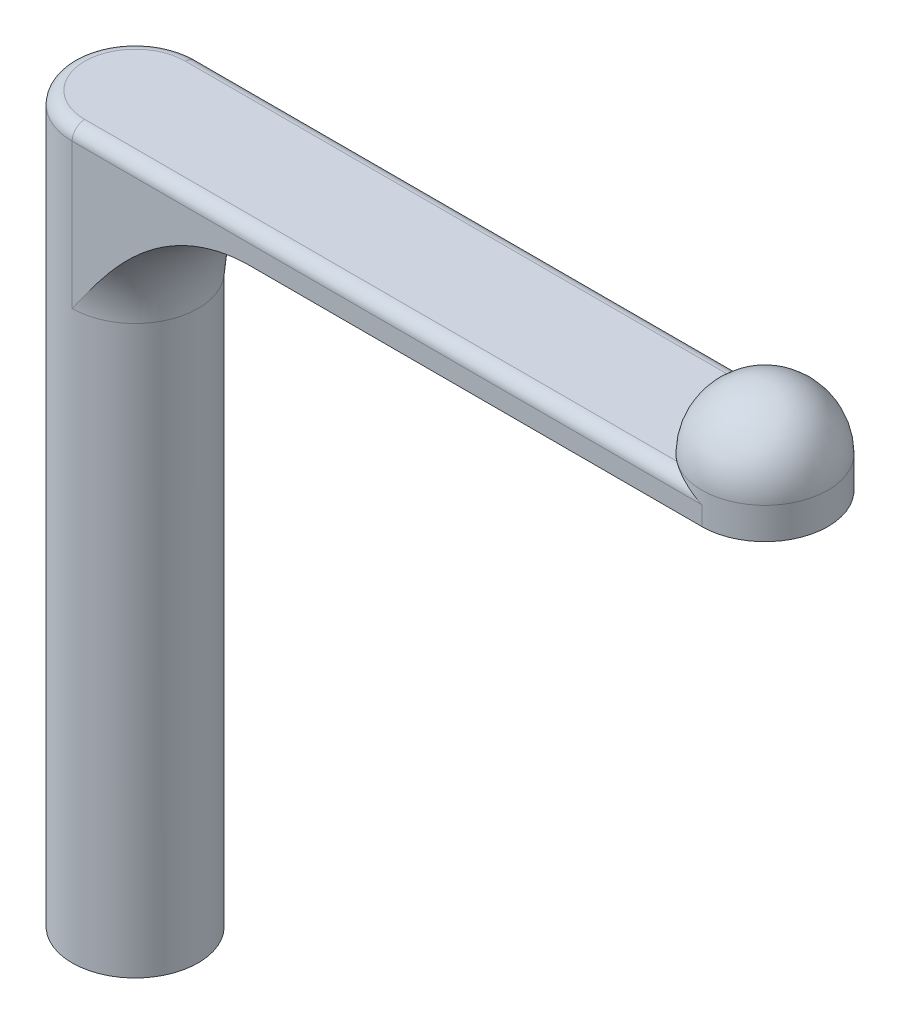
ISO-10303-21;
HEADER;
FILE_DESCRIPTION(('STEP AP214'),'2;1');
FILE_NAME('part.step','',(''),(''),'','','');
FILE_SCHEMA(('AUTOMOTIVE_DESIGN { 1 0 10303 214 1 1 1 1 }'));
ENDSEC;
DATA;
#1=APPLICATION_CONTEXT('core data for automotive mechanical design processes');
#2=APPLICATION_PROTOCOL_DEFINITION('international standard','automotive_design',2000,#1);
#3=PRODUCT_CONTEXT('',#1,'mechanical');
#4=PRODUCT('Part','Part','',(#3));
#5=PRODUCT_RELATED_PRODUCT_CATEGORY('part','',(#4));
#6=PRODUCT_DEFINITION_FORMATION('','',#4);
#7=PRODUCT_DEFINITION_CONTEXT('part definition',#1,'design');
#8=PRODUCT_DEFINITION('design','',#6,#7);
#9=PRODUCT_DEFINITION_SHAPE('','',#8);
#10=(LENGTH_UNIT() NAMED_UNIT(*) SI_UNIT(.MILLI.,.METRE.));
#11=(NAMED_UNIT(*) PLANE_ANGLE_UNIT() SI_UNIT($,.RADIAN.));
#12=(NAMED_UNIT(*) SI_UNIT($,.STERADIAN.) SOLID_ANGLE_UNIT());
#13=UNCERTAINTY_MEASURE_WITH_UNIT(LENGTH_MEASURE(1.E-05),#10,'distance_accuracy_value','');
#14=(GEOMETRIC_REPRESENTATION_CONTEXT(3) GLOBAL_UNCERTAINTY_ASSIGNED_CONTEXT((#13)) GLOBAL_UNIT_ASSIGNED_CONTEXT((#10,
#11,#12)) REPRESENTATION_CONTEXT('',''));
#15=CARTESIAN_POINT('',(0.,0.,0.));
#16=DIRECTION('',(0.,0.,1.));
#17=DIRECTION('',(1.,0.,0.));
#18=AXIS2_PLACEMENT_3D('',#15,#16,#17);
#19=CARTESIAN_POINT('',(0.,110.,0.));
#20=DIRECTION('',(0.,-1.,0.));
#21=DIRECTION('',(0.,0.,-1.));
#22=AXIS2_PLACEMENT_3D('',#19,#20,#21);
#23=CYLINDRICAL_SURFACE('',#22,10.);
#24=DIRECTION('',(0.,-1.,0.));
#25=VECTOR('',#24,1.);
#26=CARTESIAN_POINT('',(0.,115.,10.));
#27=LINE('',#26,#25);
#28=CARTESIAN_POINT('',(0.,113.,10.));
#29=VERTEX_POINT('',#28);
#30=CARTESIAN_POINT('',(0.,90.,10.));
#31=VERTEX_POINT('',#30);
#32=EDGE_CURVE('E99',#29,#31,#27,.T.);
#33=ORIENTED_EDGE('',*,*,#32,.F.);
#34=CARTESIAN_POINT('',(0.,113.,0.));
#35=DIRECTION('',(0.,1.,0.));
#36=DIRECTION('',(0.,0.,1.));
#37=AXIS2_PLACEMENT_3D('',#34,#35,#36);
#38=CIRCLE('',#37,10.);
#39=CARTESIAN_POINT('',(0.,113.,-10.));
#40=VERTEX_POINT('',#39);
#41=EDGE_CURVE('E173',#29,#40,#38,.F.);
#42=ORIENTED_EDGE('',*,*,#41,.T.);
#43=DIRECTION('',(0.,-1.,0.));
#44=VECTOR('',#43,1.);
#45=CARTESIAN_POINT('',(0.,115.,-10.));
#46=LINE('',#45,#44);
#47=CARTESIAN_POINT('',(0.,90.,-10.));
#48=VERTEX_POINT('',#47);
#49=EDGE_CURVE('E115',#40,#48,#46,.T.);
#50=ORIENTED_EDGE('',*,*,#49,.T.);
#51=CARTESIAN_POINT('',(0.,90.,0.));
#52=DIRECTION('',(0.,1.,0.));
#53=DIRECTION('',(0.,0.,1.));
#54=AXIS2_PLACEMENT_3D('',#51,#52,#53);
#55=CIRCLE('',#54,10.);
#56=EDGE_CURVE('E131',#48,#31,#55,.F.);
#57=ORIENTED_EDGE('',*,*,#56,.T.);
#58=EDGE_LOOP('',(#33,#42,#50,#57));
#59=FACE_BOUND('',#58,.T.);
#60=CARTESIAN_POINT('',(0.,0.,0.));
#61=DIRECTION('',(0.,1.,0.));
#62=DIRECTION('',(0.,0.,1.));
#63=AXIS2_PLACEMENT_3D('',#60,#61,#62);
#64=CIRCLE('',#63,10.);
#65=CARTESIAN_POINT('',(0.,0.,10.));
#66=VERTEX_POINT('',#65);
#67=EDGE_CURVE('E122',#66,#66,#64,.T.);
#68=ORIENTED_EDGE('',*,*,#67,.T.);
#69=EDGE_LOOP('',(#68));
#70=FACE_BOUND('',#69,.T.);
#71=ADVANCED_FACE('F33',(#59,#70),#23,.T.);
#72=CARTESIAN_POINT('',(0.,0.,0.));
#73=DIRECTION('',(0.,1.,0.));
#74=DIRECTION('',(0.,0.,1.));
#75=AXIS2_PLACEMENT_3D('',#72,#73,#74);
#76=PLANE('',#75);
#77=ORIENTED_EDGE('',*,*,#67,.F.);
#78=EDGE_LOOP('',(#77));
#79=FACE_BOUND('',#78,.T.);
#80=ADVANCED_FACE('F186',(#79),#76,.F.);
#81=CARTESIAN_POINT('',(0.,110.,0.));
#82=DIRECTION('',(0.,1.,0.));
#83=DIRECTION('',(0.,0.,1.));
#84=AXIS2_PLACEMENT_3D('',#81,#82,#83);
#85=PLANE('',#84);
#86=DIRECTION('',(1.,0.,0.));
#87=VECTOR('',#86,1.);
#88=CARTESIAN_POINT('',(0.,110.,10.));
#89=LINE('',#88,#87);
#90=CARTESIAN_POINT('',(28.2842712474619,110.,10.));
#91=VERTEX_POINT('',#90);
#92=CARTESIAN_POINT('',(100.,110.,10.));
#93=VERTEX_POINT('',#92);
#94=EDGE_CURVE('E103',#91,#93,#89,.T.);
#95=ORIENTED_EDGE('',*,*,#94,.F.);
#96=CARTESIAN_POINT('',(0.,110.,0.));
#97=DIRECTION('',(0.,1.,0.));
#98=DIRECTION('',(0.,0.,1.));
#99=AXIS2_PLACEMENT_3D('',#96,#97,#98);
#100=CIRCLE('',#99,30.);
#101=CARTESIAN_POINT('',(28.2842712474619,110.,-10.));
#102=VERTEX_POINT('',#101);
#103=EDGE_CURVE('E129',#91,#102,#100,.T.);
#104=ORIENTED_EDGE('',*,*,#103,.T.);
#105=DIRECTION('',(-1.,0.,0.));
#106=VECTOR('',#105,1.);
#107=CARTESIAN_POINT('',(0.,110.,-10.));
#108=LINE('',#107,#106);
#109=CARTESIAN_POINT('',(100.,110.,-10.));
#110=VERTEX_POINT('',#109);
#111=EDGE_CURVE('E113',#110,#102,#108,.T.);
#112=ORIENTED_EDGE('',*,*,#111,.F.);
#113=CARTESIAN_POINT('',(100.,110.,0.));
#114=DIRECTION('',(0.,1.,0.));
#115=DIRECTION('',(0.,0.,-1.));
#116=AXIS2_PLACEMENT_3D('',#113,#114,#115);
#117=CIRCLE('',#116,10.);
#118=EDGE_CURVE('E97',#93,#110,#117,.T.);
#119=ORIENTED_EDGE('',*,*,#118,.F.);
#120=EDGE_LOOP('',(#95,#104,#112,#119));
#121=FACE_BOUND('',#120,.T.);
#122=ADVANCED_FACE('F111',(#121),#85,.F.);
#123=CARTESIAN_POINT('',(0.,115.,10.));
#124=DIRECTION('',(0.,0.,-1.));
#125=DIRECTION('',(-1.,0.,0.));
#126=AXIS2_PLACEMENT_3D('',#123,#124,#125);
#127=PLANE('',#126);
#128=DIRECTION('',(0.,-1.,0.));
#129=VECTOR('',#128,1.);
#130=CARTESIAN_POINT('',(100.,115.,10.));
#131=LINE('',#130,#129);
#132=CARTESIAN_POINT('',(100.,113.,10.));
#133=VERTEX_POINT('',#132);
#134=EDGE_CURVE('E92',#133,#93,#131,.T.);
#135=ORIENTED_EDGE('',*,*,#134,.F.);
#136=DIRECTION('',(1.,0.,0.));
#137=VECTOR('',#136,1.);
#138=CARTESIAN_POINT('',(0.,113.,10.));
#139=LINE('',#138,#137);
#140=EDGE_CURVE('E56',#133,#29,#139,.F.);
#141=ORIENTED_EDGE('',*,*,#140,.T.);
#142=ORIENTED_EDGE('',*,*,#32,.T.);
#143=CARTESIAN_POINT('',(28.2842712474619,110.,10.));
#144=CARTESIAN_POINT('',(27.9651390568458,110.000001034043,10.));
#145=CARTESIAN_POINT('',(27.6460498610092,109.993209288578,10.));
#146=CARTESIAN_POINT('',(27.0084582659689,109.966221898985,10.));
#147=CARTESIAN_POINT('',(26.6899558302917,109.946027118271,10.));
#148=CARTESIAN_POINT('',(25.7365324181222,109.865652708535,10.));
#149=CARTESIAN_POINT('',(25.103177608994,109.785682410114,10.));
#150=CARTESIAN_POINT('',(23.8483833625762,109.575470342473,10.));
#151=CARTESIAN_POINT('',(23.2268990586456,109.445492460388,10.));
#152=CARTESIAN_POINT('',(21.995848770816,109.137582004759,10.));
#153=CARTESIAN_POINT('',(21.3862846833926,108.959641866058,10.));
#154=CARTESIAN_POINT('',(20.1545849571501,108.549309714844,10.));
#155=CARTESIAN_POINT('',(19.5331594368849,108.314790687846,10.));
#156=CARTESIAN_POINT('',(18.3097605160483,107.799736659321,10.));
#157=CARTESIAN_POINT('',(17.7077868271713,107.519202340185,10.));
#158=CARTESIAN_POINT('',(16.524922767952,106.915550557008,10.));
#159=CARTESIAN_POINT('',(15.9440533044994,106.592392259745,10.));
#160=CARTESIAN_POINT('',(14.8054536327351,105.907567571859,10.));
#161=CARTESIAN_POINT('',(14.2477257631505,105.545897302262,10.));
#162=CARTESIAN_POINT('',(13.2534321901153,104.855550130573,10.));
#163=CARTESIAN_POINT('',(12.8129669184585,104.53245492582,10.));
#164=CARTESIAN_POINT('',(11.948259881494,103.865151746542,10.));
#165=CARTESIAN_POINT('',(11.5240202342426,103.520941030814,10.));
#166=CARTESIAN_POINT('',(10.6914342972646,102.813505121559,10.));
#167=CARTESIAN_POINT('',(10.283094744106,102.450272018202,10.));
#168=CARTESIAN_POINT('',(9.48191904253468,101.707055069144,10.));
#169=CARTESIAN_POINT('',(9.08908485602855,101.327069116486,10.));
#170=CARTESIAN_POINT('',(7.93136155870328,100.163786962413,10.));
#171=CARTESIAN_POINT('',(7.18863799454963,99.3583623276856,10.));
#172=CARTESIAN_POINT('',(5.75322659601799,97.705009452149,10.));
#173=CARTESIAN_POINT('',(5.06052973206903,96.8570889286745,10.));
#174=CARTESIAN_POINT('',(4.00609970374351,95.509092488535,10.));
#175=CARTESIAN_POINT('',(3.63184460325256,95.0186850350835,10.));
#176=CARTESIAN_POINT('',(2.89270412023951,94.0317978352776,10.));
#177=CARTESIAN_POINT('',(2.52780785705488,93.5353262327577,9.99999999999999));
#178=CARTESIAN_POINT('',(1.44124749659427,92.0380031729756,10.));
#179=CARTESIAN_POINT('',(0.728720606576919,91.03056483015,10.0000000000001));
#180=CARTESIAN_POINT('',(0.0108866185501221,90.0153960052047,10.));
#181=CARTESIAN_POINT('',(0.00544330798314986,90.0076980016005,10.));
#182=CARTESIAN_POINT('',(0.,90.,10.));
#183=B_SPLINE_CURVE_WITH_KNOTS('',3,(#143,#144,#145,#146,#147,#148,#149,#150,#151,#152,#153,
#154,#155,#156,#157,#158,#159,#160,#161,#162,#163,#164,#165,#166,#167,#168,#169,#170,#171,#172,
#173,#174,#175,#176,#177,#178,#179,#180,#181,#182),.UNSPECIFIED.,.F.,.F.,(4,2,2,2,2,2,2,2,2,2,2,
2,2,2,2,2,2,2,2,4),(0.,0.957242402902731,1.91442314685275,3.82723635773294,5.73009122095737,
7.63324640008251,9.62388423822012,11.6144925585543,13.6070218977363,15.5997521171352,
17.237873015252,18.8762070251537,20.5152277764301,22.1544552538208,25.4383869346115,
28.7217243929412,30.572333440903,32.4206832909639,36.1223683671328,36.1506526383801),.UNSPECIFIED.);
#184=EDGE_CURVE('E106',#31,#91,#183,.F.);
#185=ORIENTED_EDGE('',*,*,#184,.T.);
#186=ORIENTED_EDGE('',*,*,#94,.T.);
#187=EDGE_LOOP('',(#135,#141,#142,#185,#186));
#188=FACE_BOUND('',#187,.T.);
#189=ADVANCED_FACE('F104',(#188),#127,.F.);
#190=CARTESIAN_POINT('',(100.,115.,0.));
#191=DIRECTION('',(0.,-1.,0.));
#192=DIRECTION('',(0.,0.,-1.));
#193=AXIS2_PLACEMENT_3D('',#190,#191,#192);
#194=CYLINDRICAL_SURFACE('',#193,10.);
#195=CARTESIAN_POINT('',(100.,115.001,0.));
#196=DIRECTION('',(0.,-1.,0.));
#197=DIRECTION('',(0.,0.,-1.));
#198=AXIS2_PLACEMENT_3D('',#195,#196,#197);
#199=CIRCLE('',#198,10.);
#200=CARTESIAN_POINT('',(100.,115.001,-10.));
#201=VERTEX_POINT('',#200);
#202=EDGE_CURVE('E126',#201,#201,#199,.T.);
#203=ORIENTED_EDGE('',*,*,#202,.T.);
#204=EDGE_LOOP('',(#203));
#205=FACE_BOUND('',#204,.T.);
#206=ORIENTED_EDGE('',*,*,#118,.T.);
#207=DIRECTION('',(0.,-1.,0.));
#208=VECTOR('',#207,1.);
#209=CARTESIAN_POINT('',(100.,115.,-10.));
#210=LINE('',#209,#208);
#211=CARTESIAN_POINT('',(100.,113.,-10.));
#212=VERTEX_POINT('',#211);
#213=EDGE_CURVE('E100',#212,#110,#210,.T.);
#214=ORIENTED_EDGE('',*,*,#213,.F.);
#215=CARTESIAN_POINT('',(94.,115.,-8.));
#216=CARTESIAN_POINT('',(94.0630463775369,114.999995470432,-8.04728628829572));
#217=CARTESIAN_POINT('',(94.1266375774729,114.998323614549,-8.09381347875292));
#218=CARTESIAN_POINT('',(94.2547800525034,114.991928591834,-8.18526953333759));
#219=CARTESIAN_POINT('',(94.319331017716,114.987206389834,-8.23019889812229));
#220=CARTESIAN_POINT('',(94.5140296841657,114.968911719548,-8.36233782797795));
#221=CARTESIAN_POINT('',(94.645476188749,114.951208885584,-8.44708785721121));
#222=CARTESIAN_POINT('',(94.9101086914059,114.90682523983,-8.60911903919257));
#223=CARTESIAN_POINT('',(95.0432768704804,114.880206067599,-8.68644690431449));
#224=CARTESIAN_POINT('',(95.3117717075155,114.819452422556,-8.83425262753246));
#225=CARTESIAN_POINT('',(95.4470997295332,114.785313010788,-8.90472593981301));
#226=CARTESIAN_POINT('',(95.8061393307986,114.68706305091,-9.08147710972194));
#227=CARTESIAN_POINT('',(96.0312725559427,114.617708257001,-9.18198793122163));
#228=CARTESIAN_POINT('',(96.4846842496433,114.466620027569,-9.36495514606715));
#229=CARTESIAN_POINT('',(96.7129640110113,114.384881357213,-9.4474038680967));
#230=CARTESIAN_POINT('',(97.172604284886,114.211979458359,-9.5950152471495));
#231=CARTESIAN_POINT('',(97.4039733356119,114.120780748231,-9.66010929752243));
#232=CARTESIAN_POINT('',(97.8681415022247,113.931905156216,-9.77303511860858));
#233=CARTESIAN_POINT('',(98.1009401348409,113.83423036479,-9.82087242794254));
#234=CARTESIAN_POINT('',(98.6082081275916,113.617155540801,-9.90657044886332));
#235=CARTESIAN_POINT('',(98.8828658559034,113.496936925707,-9.94123736424317));
#236=CARTESIAN_POINT('',(99.4322971276372,113.253857161667,-9.98766939586876));
#237=CARTESIAN_POINT('',(99.7070692425953,113.131002027529,-9.99948198501856));
#238=CARTESIAN_POINT('',(99.9878284343329,113.005443288842,-9.99999444153997));
#239=CARTESIAN_POINT('',(99.9939142438127,113.002721632049,-9.9999999968566));
#240=CARTESIAN_POINT('',(100.,113.,-10.));
#241=B_SPLINE_CURVE_WITH_KNOTS('',3,(#215,#216,#217,#218,#219,#220,#221,#222,#223,#224,#225,
#226,#227,#228,#229,#230,#231,#232,#233,#234,#235,#236,#237,#238,#239,#240),.UNSPECIFIED.,.F.,
.F.,(4,2,2,2,2,2,2,2,2,2,2,2,4),(0.,0.236371159892356,0.472667591527118,0.944315101860609,
1.41276713949764,1.88152775757092,2.64870335126678,3.41620414998953,4.18669550285123,
4.95693934291847,5.86148159841718,6.76414291697836,6.78414292392343),.UNSPECIFIED.);
#242=CARTESIAN_POINT('',(94.,115.,-8.));
#243=VERTEX_POINT('',#242);
#244=EDGE_CURVE('E43',#212,#243,#241,.F.);
#245=ORIENTED_EDGE('',*,*,#244,.T.);
#246=CARTESIAN_POINT('',(100.,115.,0.));
#247=DIRECTION('',(0.,1.,0.));
#248=DIRECTION('',(0.,0.,1.));
#249=AXIS2_PLACEMENT_3D('',#246,#247,#248);
#250=CIRCLE('',#249,10.);
#251=CARTESIAN_POINT('',(94.,115.,8.));
#252=VERTEX_POINT('',#251);
#253=EDGE_CURVE('E125',#243,#252,#250,.T.);
#254=ORIENTED_EDGE('',*,*,#253,.T.);
#255=CARTESIAN_POINT('',(94.,115.,8.));
#256=CARTESIAN_POINT('',(94.0630463775369,114.999995470432,8.04728628829572));
#257=CARTESIAN_POINT('',(94.1266375774729,114.998323614549,8.09381347875292));
#258=CARTESIAN_POINT('',(94.2547800525034,114.991928591834,8.18526953333759));
#259=CARTESIAN_POINT('',(94.319331017716,114.987206389834,8.23019889812229));
#260=CARTESIAN_POINT('',(94.5140296841657,114.968911719548,8.36233782797795));
#261=CARTESIAN_POINT('',(94.645476188749,114.951208885584,8.44708785721121));
#262=CARTESIAN_POINT('',(94.9101086914059,114.90682523983,8.60911903919257));
#263=CARTESIAN_POINT('',(95.0432768704804,114.880206067599,8.68644690431449));
#264=CARTESIAN_POINT('',(95.3117717075155,114.819452422556,8.83425262753246));
#265=CARTESIAN_POINT('',(95.4470997295332,114.785313010788,8.90472593981301));
#266=CARTESIAN_POINT('',(95.8061393307986,114.68706305091,9.08147710972194));
#267=CARTESIAN_POINT('',(96.0312725559427,114.617708257001,9.18198793122163));
#268=CARTESIAN_POINT('',(96.4846842496433,114.466620027569,9.36495514606715));
#269=CARTESIAN_POINT('',(96.7129640110113,114.384881357213,9.4474038680967));
#270=CARTESIAN_POINT('',(97.172604284886,114.211979458359,9.5950152471495));
#271=CARTESIAN_POINT('',(97.4039733356119,114.120780748231,9.66010929752243));
#272=CARTESIAN_POINT('',(97.8681415022247,113.931905156216,9.77303511860858));
#273=CARTESIAN_POINT('',(98.1009401348409,113.83423036479,9.82087242794254));
#274=CARTESIAN_POINT('',(98.6082081275916,113.617155540801,9.90657044886332));
#275=CARTESIAN_POINT('',(98.8828658559034,113.496936925707,9.94123736424317));
#276=CARTESIAN_POINT('',(99.4322971276372,113.253857161667,9.98766939586876));
#277=CARTESIAN_POINT('',(99.7070692425953,113.131002027529,9.99948198501856));
#278=CARTESIAN_POINT('',(99.9878284343329,113.005443288842,9.99999444153997));
#279=CARTESIAN_POINT('',(99.9939142438127,113.002721632049,9.9999999968566));
#280=CARTESIAN_POINT('',(100.,113.,10.));
#281=B_SPLINE_CURVE_WITH_KNOTS('',3,(#255,#256,#257,#258,#259,#260,#261,#262,#263,#264,#265,
#266,#267,#268,#269,#270,#271,#272,#273,#274,#275,#276,#277,#278,#279,#280),.UNSPECIFIED.,.F.,
.F.,(4,2,2,2,2,2,2,2,2,2,2,2,4),(0.,0.236371159892356,0.472667591527118,0.944315101860609,
1.41276713949764,1.88152775757092,2.64870335126678,3.41620414998953,4.18669550285123,
4.95693934291847,5.86148159841718,6.76414291697836,6.78414292392343),.UNSPECIFIED.);
#282=EDGE_CURVE('E11',#252,#133,#281,.T.);
#283=ORIENTED_EDGE('',*,*,#282,.T.);
#284=ORIENTED_EDGE('',*,*,#134,.T.);
#285=EDGE_LOOP('',(#206,#214,#245,#254,#283,#284));
#286=FACE_BOUND('',#285,.T.);
#287=ADVANCED_FACE('F94',(#205,#286),#194,.T.);
#288=CARTESIAN_POINT('',(0.,115.,-10.));
#289=DIRECTION('',(0.,0.,1.));
#290=DIRECTION('',(1.,0.,0.));
#291=AXIS2_PLACEMENT_3D('',#288,#289,#290);
#292=PLANE('',#291);
#293=ORIENTED_EDGE('',*,*,#49,.F.);
#294=DIRECTION('',(-1.,0.,0.));
#295=VECTOR('',#294,1.);
#296=CARTESIAN_POINT('',(100.,113.,-10.));
#297=LINE('',#296,#295);
#298=EDGE_CURVE('E208',#40,#212,#297,.F.);
#299=ORIENTED_EDGE('',*,*,#298,.T.);
#300=ORIENTED_EDGE('',*,*,#213,.T.);
#301=ORIENTED_EDGE('',*,*,#111,.T.);
#302=CARTESIAN_POINT('',(28.2842712474619,110.,-10.));
#303=CARTESIAN_POINT('',(27.9651390568458,110.000001034043,-10.));
#304=CARTESIAN_POINT('',(27.6460498610092,109.993209288578,-10.));
#305=CARTESIAN_POINT('',(27.0084582659689,109.966221898985,-10.));
#306=CARTESIAN_POINT('',(26.6899558302917,109.946027118271,-10.));
#307=CARTESIAN_POINT('',(25.7365324181222,109.865652708535,-10.));
#308=CARTESIAN_POINT('',(25.103177608994,109.785682410114,-10.));
#309=CARTESIAN_POINT('',(23.8483833625762,109.575470342473,-10.));
#310=CARTESIAN_POINT('',(23.2268990586456,109.445492460388,-10.));
#311=CARTESIAN_POINT('',(21.995848770816,109.137582004759,-10.));
#312=CARTESIAN_POINT('',(21.3862846833926,108.959641866058,-10.));
#313=CARTESIAN_POINT('',(20.1545849571501,108.549309714844,-10.));
#314=CARTESIAN_POINT('',(19.5331594368849,108.314790687846,-10.));
#315=CARTESIAN_POINT('',(18.3097605160483,107.799736659321,-10.));
#316=CARTESIAN_POINT('',(17.7077868271713,107.519202340185,-10.));
#317=CARTESIAN_POINT('',(16.524922767952,106.915550557008,-10.));
#318=CARTESIAN_POINT('',(15.9440533044994,106.592392259745,-10.));
#319=CARTESIAN_POINT('',(14.8054536327351,105.907567571859,-10.));
#320=CARTESIAN_POINT('',(14.2477257631505,105.545897302262,-10.));
#321=CARTESIAN_POINT('',(13.2534321901153,104.855550130573,-10.));
#322=CARTESIAN_POINT('',(12.8129669184585,104.53245492582,-10.));
#323=CARTESIAN_POINT('',(11.948259881494,103.865151746542,-10.));
#324=CARTESIAN_POINT('',(11.5240202342426,103.520941030814,-10.));
#325=CARTESIAN_POINT('',(10.6914342972646,102.813505121559,-10.));
#326=CARTESIAN_POINT('',(10.283094744106,102.450272018202,-10.));
#327=CARTESIAN_POINT('',(9.48191904253468,101.707055069144,-10.));
#328=CARTESIAN_POINT('',(9.08908485602855,101.327069116486,-10.));
#329=CARTESIAN_POINT('',(7.93136155870328,100.163786962413,-10.));
#330=CARTESIAN_POINT('',(7.18863799454963,99.3583623276856,-10.));
#331=CARTESIAN_POINT('',(5.75322659601799,97.705009452149,-10.));
#332=CARTESIAN_POINT('',(5.06052973206903,96.8570889286745,-10.));
#333=CARTESIAN_POINT('',(4.00609970374351,95.509092488535,-10.));
#334=CARTESIAN_POINT('',(3.63184460325256,95.0186850350835,-10.));
#335=CARTESIAN_POINT('',(2.89270412023951,94.0317978352776,-10.));
#336=CARTESIAN_POINT('',(2.52780785705488,93.5353262327577,-9.99999999999999));
#337=CARTESIAN_POINT('',(1.44124749659427,92.0380031729756,-10.));
#338=CARTESIAN_POINT('',(0.728720606576919,91.03056483015,-10.0000000000001));
#339=CARTESIAN_POINT('',(0.0108866185501221,90.0153960052047,-10.));
#340=CARTESIAN_POINT('',(0.00544330798314986,90.0076980016005,-10.));
#341=CARTESIAN_POINT('',(0.,90.,-10.));
#342=B_SPLINE_CURVE_WITH_KNOTS('',3,(#302,#303,#304,#305,#306,#307,#308,#309,#310,#311,#312,
#313,#314,#315,#316,#317,#318,#319,#320,#321,#322,#323,#324,#325,#326,#327,#328,#329,#330,#331,
#332,#333,#334,#335,#336,#337,#338,#339,#340,#341),.UNSPECIFIED.,.F.,.F.,(4,2,2,2,2,2,2,2,2,2,2,
2,2,2,2,2,2,2,2,4),(0.,0.957242402902731,1.91442314685275,3.82723635773294,5.73009122095737,
7.63324640008251,9.62388423822012,11.6144925585543,13.6070218977363,15.5997521171352,
17.237873015252,18.8762070251537,20.5152277764301,22.1544552538208,25.4383869346115,
28.7217243929412,30.572333440903,32.4206832909639,36.1223683671328,36.1506526383801),.UNSPECIFIED.);
#343=EDGE_CURVE('E134',#102,#48,#342,.T.);
#344=ORIENTED_EDGE('',*,*,#343,.T.);
#345=EDGE_LOOP('',(#293,#299,#300,#301,#344));
#346=FACE_BOUND('',#345,.T.);
#347=ADVANCED_FACE('F149',(#346),#292,.F.);
#348=CARTESIAN_POINT('',(0.,115.,0.));
#349=DIRECTION('',(0.,1.,0.));
#350=DIRECTION('',(0.,0.,1.));
#351=AXIS2_PLACEMENT_3D('',#348,#349,#350);
#352=PLANE('',#351);
#353=ORIENTED_EDGE('',*,*,#253,.F.);
#354=DIRECTION('',(-1.,0.,0.));
#355=VECTOR('',#354,1.);
#356=CARTESIAN_POINT('',(0.,115.,-8.));
#357=LINE('',#356,#355);
#358=CARTESIAN_POINT('',(0.,115.,-8.));
#359=VERTEX_POINT('',#358);
#360=EDGE_CURVE('E209',#243,#359,#357,.T.);
#361=ORIENTED_EDGE('',*,*,#360,.T.);
#362=CARTESIAN_POINT('',(0.,115.,0.));
#363=DIRECTION('',(0.,1.,0.));
#364=DIRECTION('',(0.,0.,1.));
#365=AXIS2_PLACEMENT_3D('',#362,#363,#364);
#366=CIRCLE('',#365,8.);
#367=CARTESIAN_POINT('',(0.,115.,8.));
#368=VERTEX_POINT('',#367);
#369=EDGE_CURVE('E214',#359,#368,#366,.T.);
#370=ORIENTED_EDGE('',*,*,#369,.T.);
#371=DIRECTION('',(1.,0.,0.));
#372=VECTOR('',#371,1.);
#373=CARTESIAN_POINT('',(100.,115.,8.));
#374=LINE('',#373,#372);
#375=EDGE_CURVE('E203',#368,#252,#374,.T.);
#376=ORIENTED_EDGE('',*,*,#375,.T.);
#377=EDGE_LOOP('',(#353,#361,#370,#376));
#378=FACE_BOUND('',#377,.T.);
#379=ADVANCED_FACE('F217',(#378),#352,.T.);
#380=CARTESIAN_POINT('',(100.,115.001,0.));
#381=DIRECTION('',(0.,1.,0.));
#382=DIRECTION('',(0.,0.,1.));
#383=AXIS2_PLACEMENT_3D('',#380,#381,#382);
#384=SPHERICAL_SURFACE('',#383,10.);
#385=ORIENTED_EDGE('',*,*,#202,.F.);
#386=EDGE_LOOP('',(#385));
#387=FACE_BOUND('',#386,.T.);
#388=ADVANCED_FACE('F158',(#387),#384,.T.);
#389=CARTESIAN_POINT('',(0.,90.,0.));
#390=DIRECTION('',(0.,1.,0.));
#391=DIRECTION('',(0.,0.,1.));
#392=AXIS2_PLACEMENT_3D('',#389,#390,#391);
#393=TOROIDAL_SURFACE('',#392,30.,20.);
#394=ORIENTED_EDGE('',*,*,#184,.F.);
#395=ORIENTED_EDGE('',*,*,#56,.F.);
#396=ORIENTED_EDGE('',*,*,#343,.F.);
#397=ORIENTED_EDGE('',*,*,#103,.F.);
#398=EDGE_LOOP('',(#394,#395,#396,#397));
#399=FACE_BOUND('',#398,.T.);
#400=ADVANCED_FACE('F153',(#399),#393,.F.);
#401=CARTESIAN_POINT('',(0.,113.,8.));
#402=DIRECTION('',(-1.,0.,0.));
#403=DIRECTION('',(0.,0.,1.));
#404=AXIS2_PLACEMENT_3D('',#401,#402,#403);
#405=CYLINDRICAL_SURFACE('',#404,2.);
#406=ORIENTED_EDGE('',*,*,#282,.F.);
#407=ORIENTED_EDGE('',*,*,#375,.F.);
#408=CARTESIAN_POINT('',(0.,113.,8.));
#409=DIRECTION('',(-1.,0.,0.));
#410=DIRECTION('',(0.,0.,1.));
#411=AXIS2_PLACEMENT_3D('',#408,#409,#410);
#412=CIRCLE('',#411,2.);
#413=EDGE_CURVE('E38',#29,#368,#412,.T.);
#414=ORIENTED_EDGE('',*,*,#413,.F.);
#415=ORIENTED_EDGE('',*,*,#140,.F.);
#416=EDGE_LOOP('',(#406,#407,#414,#415));
#417=FACE_BOUND('',#416,.T.);
#418=ADVANCED_FACE('F35',(#417),#405,.T.);
#419=CARTESIAN_POINT('',(0.,113.,0.));
#420=DIRECTION('',(0.,1.,0.));
#421=DIRECTION('',(0.,0.,1.));
#422=AXIS2_PLACEMENT_3D('',#419,#420,#421);
#423=TOROIDAL_SURFACE('',#422,8.,2.);
#424=ORIENTED_EDGE('',*,*,#413,.T.);
#425=ORIENTED_EDGE('',*,*,#369,.F.);
#426=CARTESIAN_POINT('',(0.,113.,-8.));
#427=DIRECTION('',(1.,0.,0.));
#428=DIRECTION('',(0.,0.,-1.));
#429=AXIS2_PLACEMENT_3D('',#426,#427,#428);
#430=CIRCLE('',#429,2.);
#431=EDGE_CURVE('E206',#40,#359,#430,.T.);
#432=ORIENTED_EDGE('',*,*,#431,.F.);
#433=ORIENTED_EDGE('',*,*,#41,.F.);
#434=EDGE_LOOP('',(#424,#425,#432,#433));
#435=FACE_BOUND('',#434,.T.);
#436=ADVANCED_FACE('F165',(#435),#423,.T.);
#437=CARTESIAN_POINT('',(0.,113.,-8.));
#438=DIRECTION('',(1.,0.,0.));
#439=DIRECTION('',(0.,0.,-1.));
#440=AXIS2_PLACEMENT_3D('',#437,#438,#439);
#441=CYLINDRICAL_SURFACE('',#440,2.);
#442=ORIENTED_EDGE('',*,*,#244,.F.);
#443=ORIENTED_EDGE('',*,*,#298,.F.);
#444=ORIENTED_EDGE('',*,*,#431,.T.);
#445=ORIENTED_EDGE('',*,*,#360,.F.);
#446=EDGE_LOOP('',(#442,#443,#444,#445));
#447=FACE_BOUND('',#446,.T.);
#448=ADVANCED_FACE('F161',(#447),#441,.T.);
#449=CLOSED_SHELL('',(#71,#80,#122,#189,#287,#347,#379,#388,#400,#418,#436,#448));
#450=MANIFOLD_SOLID_BREP('B2',#449);
#451=ADVANCED_BREP_SHAPE_REPRESENTATION('',(#18,#450),#14);
#452=SHAPE_DEFINITION_REPRESENTATION(#9,#451);
ENDSEC;
END-ISO-10303-21;
